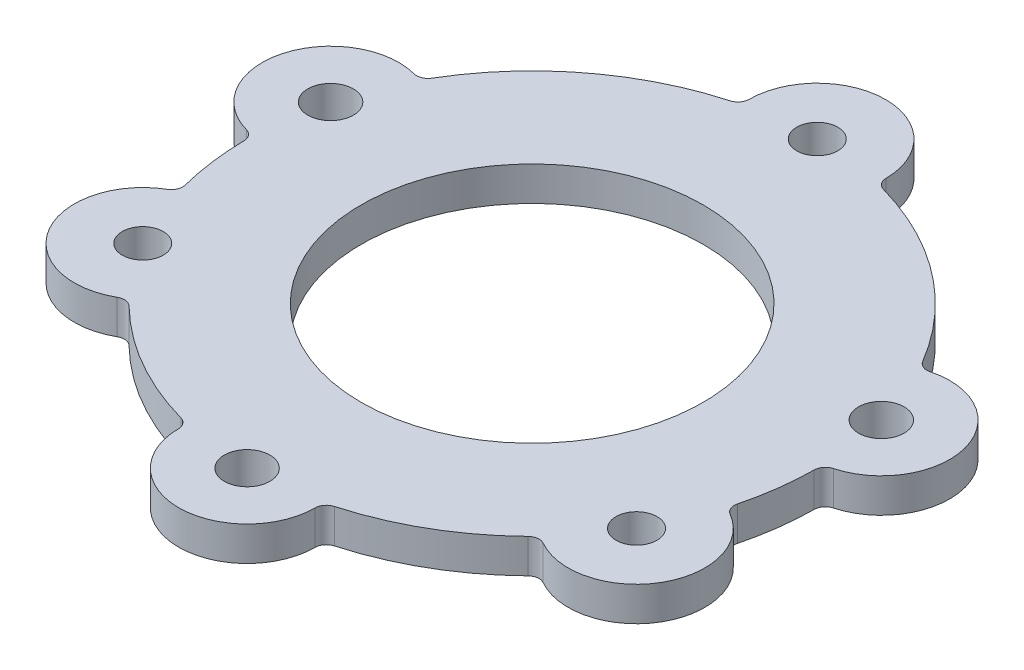
ISO-10303-21;
HEADER;
FILE_DESCRIPTION(('STEP AP214'),'2;1');
FILE_NAME('part.step','',(''),(''),'','','');
FILE_SCHEMA(('AUTOMOTIVE_DESIGN { 1 0 10303 214 1 1 1 1 }'));
ENDSEC;
DATA;
#1=APPLICATION_CONTEXT('core data for automotive mechanical design processes');
#2=APPLICATION_PROTOCOL_DEFINITION('international standard','automotive_design',2000,#1);
#3=PRODUCT_CONTEXT('',#1,'mechanical');
#4=PRODUCT('Part','Part','',(#3));
#5=PRODUCT_RELATED_PRODUCT_CATEGORY('part','',(#4));
#6=PRODUCT_DEFINITION_FORMATION('','',#4);
#7=PRODUCT_DEFINITION_CONTEXT('part definition',#1,'design');
#8=PRODUCT_DEFINITION('design','',#6,#7);
#9=PRODUCT_DEFINITION_SHAPE('','',#8);
#10=(LENGTH_UNIT() NAMED_UNIT(*) SI_UNIT(.MILLI.,.METRE.));
#11=(NAMED_UNIT(*) PLANE_ANGLE_UNIT() SI_UNIT($,.RADIAN.));
#12=(NAMED_UNIT(*) SI_UNIT($,.STERADIAN.) SOLID_ANGLE_UNIT());
#13=UNCERTAINTY_MEASURE_WITH_UNIT(LENGTH_MEASURE(1.E-05),#10,'distance_accuracy_value','');
#14=(GEOMETRIC_REPRESENTATION_CONTEXT(3) GLOBAL_UNCERTAINTY_ASSIGNED_CONTEXT((#13)) GLOBAL_UNIT_ASSIGNED_CONTEXT((#10,
#11,#12)) REPRESENTATION_CONTEXT('',''));
#15=CARTESIAN_POINT('',(0.,0.,0.));
#16=DIRECTION('',(0.,0.,1.));
#17=DIRECTION('',(1.,0.,0.));
#18=AXIS2_PLACEMENT_3D('',#15,#16,#17);
#19=CARTESIAN_POINT('',(0.,1.5,0.));
#20=DIRECTION('',(0.,-1.,0.));
#21=DIRECTION('',(0.,0.,-1.));
#22=AXIS2_PLACEMENT_3D('',#19,#20,#21);
#23=CYLINDRICAL_SURFACE('',#22,12.5);
#24=CARTESIAN_POINT('',(0.,0.,0.));
#25=DIRECTION('',(0.,1.,0.));
#26=DIRECTION('',(0.,0.,1.));
#27=AXIS2_PLACEMENT_3D('',#24,#25,#26);
#28=CIRCLE('',#27,12.5);
#29=CARTESIAN_POINT('',(3.36532966988113,0.,12.0384615384615));
#30=VERTEX_POINT('',#29);
#31=CARTESIAN_POINT('',(8.74294867984898,0.,8.93369175545737));
#32=VERTEX_POINT('',#31);
#33=EDGE_CURVE('E224',#30,#32,#28,.T.);
#34=ORIENTED_EDGE('',*,*,#33,.T.);
#35=DIRECTION('',(0.,-1.,0.));
#36=VECTOR('',#35,1.);
#37=CARTESIAN_POINT('',(8.74294867984898,1.5,8.93369175545737));
#38=LINE('',#37,#36);
#39=CARTESIAN_POINT('',(8.74294867984898,1.5,8.93369175545737));
#40=VERTEX_POINT('',#39);
#41=EDGE_CURVE('E241',#32,#40,#38,.F.);
#42=ORIENTED_EDGE('',*,*,#41,.T.);
#43=CARTESIAN_POINT('',(0.,1.5,0.));
#44=DIRECTION('',(0.,1.,0.));
#45=DIRECTION('',(0.,0.,1.));
#46=AXIS2_PLACEMENT_3D('',#43,#44,#45);
#47=CIRCLE('',#46,12.5);
#48=CARTESIAN_POINT('',(3.36532966988113,1.5,12.0384615384615));
#49=VERTEX_POINT('',#48);
#50=EDGE_CURVE('E344',#49,#40,#47,.T.);
#51=ORIENTED_EDGE('',*,*,#50,.F.);
#52=DIRECTION('',(0.,-1.,0.));
#53=VECTOR('',#52,1.);
#54=CARTESIAN_POINT('',(3.36532966988113,1.5,12.0384615384615));
#55=LINE('',#54,#53);
#56=EDGE_CURVE('E230',#49,#30,#55,.T.);
#57=ORIENTED_EDGE('',*,*,#56,.T.);
#58=EDGE_LOOP('',(#34,#42,#51,#57));
#59=FACE_BOUND('',#58,.T.);
#60=ADVANCED_FACE('F39',(#59),#23,.T.);
#61=CARTESIAN_POINT('',(10.8253175473055,1.5,6.25000000000006));
#62=DIRECTION('',(0.,-1.,0.));
#63=DIRECTION('',(0.,0.,-1.));
#64=AXIS2_PLACEMENT_3D('',#61,#62,#63);
#65=CYLINDRICAL_SURFACE('',#64,3.);
#66=CARTESIAN_POINT('',(10.8253175473055,1.5,6.25000000000006));
#67=DIRECTION('',(0.,1.,0.));
#68=DIRECTION('',(0.,0.,1.));
#69=AXIS2_PLACEMENT_3D('',#66,#67,#68);
#70=CIRCLE('',#69,3.);
#71=CARTESIAN_POINT('',(12.3401392070888,1.5,3.66053763513523));
#72=VERTEX_POINT('',#71);
#73=CARTESIAN_POINT('',(9.34018818708045,1.5,8.85660522200772));
#74=VERTEX_POINT('',#73);
#75=EDGE_CURVE('E349',#72,#74,#70,.F.);
#76=ORIENTED_EDGE('',*,*,#75,.T.);
#77=DIRECTION('',(0.,-1.,0.));
#78=VECTOR('',#77,1.);
#79=CARTESIAN_POINT('',(9.34018818708045,1.5,8.85660522200772));
#80=LINE('',#79,#78);
#81=CARTESIAN_POINT('',(9.34018818708045,0.,8.85660522200772));
#82=VERTEX_POINT('',#81);
#83=EDGE_CURVE('E223',#74,#82,#80,.T.);
#84=ORIENTED_EDGE('',*,*,#83,.T.);
#85=CARTESIAN_POINT('',(10.8253175473055,0.,6.25000000000006));
#86=DIRECTION('',(0.,1.,0.));
#87=DIRECTION('',(0.,0.,1.));
#88=AXIS2_PLACEMENT_3D('',#85,#86,#87);
#89=CIRCLE('',#88,3.);
#90=CARTESIAN_POINT('',(12.3401392070888,0.,3.66053763513523));
#91=VERTEX_POINT('',#90);
#92=EDGE_CURVE('E206',#91,#82,#89,.F.);
#93=ORIENTED_EDGE('',*,*,#92,.F.);
#94=DIRECTION('',(0.,-1.,0.));
#95=VECTOR('',#94,1.);
#96=CARTESIAN_POINT('',(12.3401392070888,1.5,3.66053763513523));
#97=LINE('',#96,#95);
#98=EDGE_CURVE('E220',#91,#72,#97,.F.);
#99=ORIENTED_EDGE('',*,*,#98,.T.);
#100=EDGE_LOOP('',(#76,#84,#93,#99));
#101=FACE_BOUND('',#100,.T.);
#102=ADVANCED_FACE('F219',(#101),#65,.T.);
#103=CARTESIAN_POINT('',(0.,1.5,0.));
#104=DIRECTION('',(0.,-1.,0.));
#105=DIRECTION('',(0.,0.,-1.));
#106=AXIS2_PLACEMENT_3D('',#103,#104,#105);
#107=CYLINDRICAL_SURFACE('',#106,12.5);
#108=CARTESIAN_POINT('',(0.,1.5,0.));
#109=DIRECTION('',(0.,1.,0.));
#110=DIRECTION('',(0.,0.,1.));
#111=AXIS2_PLACEMENT_3D('',#108,#109,#110);
#112=CIRCLE('',#111,12.5);
#113=CARTESIAN_POINT('',(12.1082783497301,1.5,3.10476978300426));
#114=VERTEX_POINT('',#113);
#115=CARTESIAN_POINT('',(12.4992723204014,1.5,0.134875722227054));
#116=VERTEX_POINT('',#115);
#117=EDGE_CURVE('E351',#114,#116,#112,.T.);
#118=ORIENTED_EDGE('',*,*,#117,.F.);
#119=DIRECTION('',(0.,-1.,0.));
#120=VECTOR('',#119,1.);
#121=CARTESIAN_POINT('',(12.1082783497301,1.5,3.10476978300426));
#122=LINE('',#121,#120);
#123=CARTESIAN_POINT('',(12.1082783497301,0.,3.10476978300426));
#124=VERTEX_POINT('',#123);
#125=EDGE_CURVE('E245',#114,#124,#122,.T.);
#126=ORIENTED_EDGE('',*,*,#125,.T.);
#127=CARTESIAN_POINT('',(0.,0.,0.));
#128=DIRECTION('',(0.,1.,0.));
#129=DIRECTION('',(0.,0.,1.));
#130=AXIS2_PLACEMENT_3D('',#127,#128,#129);
#131=CIRCLE('',#130,12.5);
#132=CARTESIAN_POINT('',(12.4992723204014,0.,0.134875722227054));
#133=VERTEX_POINT('',#132);
#134=EDGE_CURVE('E208',#124,#133,#131,.T.);
#135=ORIENTED_EDGE('',*,*,#134,.T.);
#136=DIRECTION('',(0.,-1.,0.));
#137=VECTOR('',#136,1.);
#138=CARTESIAN_POINT('',(12.4992723204014,1.5,0.134875722227054));
#139=LINE('',#138,#137);
#140=EDGE_CURVE('E243',#133,#116,#139,.F.);
#141=ORIENTED_EDGE('',*,*,#140,.T.);
#142=EDGE_LOOP('',(#118,#126,#135,#141));
#143=FACE_BOUND('',#142,.T.);
#144=ADVANCED_FACE('F464',(#143),#107,.T.);
#145=CARTESIAN_POINT('',(12.0740728286134,1.5,-3.23523806378147));
#146=DIRECTION('',(0.,-1.,0.));
#147=DIRECTION('',(0.,0.,-1.));
#148=AXIS2_PLACEMENT_3D('',#145,#146,#147);
#149=CYLINDRICAL_SURFACE('',#148,3.);
#150=CARTESIAN_POINT('',(12.0740728286134,1.5,-3.23523806378147));
#151=DIRECTION('',(0.,1.,0.));
#152=DIRECTION('',(0.,0.,1.));
#153=AXIS2_PLACEMENT_3D('',#150,#151,#152);
#154=CIRCLE('',#153,3.);
#155=CARTESIAN_POINT('',(11.3141870987112,1.5,-6.13740512952579));
#156=VERTEX_POINT('',#155);
#157=CARTESIAN_POINT('',(12.8670760154169,1.5,-0.341944793869236));
#158=VERTEX_POINT('',#157);
#159=EDGE_CURVE('E358',#156,#158,#154,.F.);
#160=ORIENTED_EDGE('',*,*,#159,.T.);
#161=DIRECTION('',(0.,-1.,0.));
#162=VECTOR('',#161,1.);
#163=CARTESIAN_POINT('',(12.8670760154169,1.5,-0.341944793869235));
#164=LINE('',#163,#162);
#165=CARTESIAN_POINT('',(12.8670760154169,0.,-0.341944793869236));
#166=VERTEX_POINT('',#165);
#167=EDGE_CURVE('E249',#158,#166,#164,.T.);
#168=ORIENTED_EDGE('',*,*,#167,.T.);
#169=CARTESIAN_POINT('',(12.0740728286134,0.,-3.23523806378147));
#170=DIRECTION('',(0.,1.,0.));
#171=DIRECTION('',(0.,0.,1.));
#172=AXIS2_PLACEMENT_3D('',#169,#170,#171);
#173=CIRCLE('',#172,3.);
#174=CARTESIAN_POINT('',(11.3141870987112,0.,-6.13740512952579));
#175=VERTEX_POINT('',#174);
#176=EDGE_CURVE('E401',#175,#166,#173,.F.);
#177=ORIENTED_EDGE('',*,*,#176,.F.);
#178=DIRECTION('',(0.,-1.,0.));
#179=VECTOR('',#178,1.);
#180=CARTESIAN_POINT('',(11.3141870987112,1.5,-6.13740512952579));
#181=LINE('',#180,#179);
#182=EDGE_CURVE('E247',#175,#156,#181,.F.);
#183=ORIENTED_EDGE('',*,*,#182,.T.);
#184=EDGE_LOOP('',(#160,#168,#177,#183));
#185=FACE_BOUND('',#184,.T.);
#186=ADVANCED_FACE('F560',(#185),#149,.T.);
#187=CARTESIAN_POINT('',(0.,1.5,0.));
#188=DIRECTION('',(0.,-1.,0.));
#189=DIRECTION('',(0.,0.,-1.));
#190=AXIS2_PLACEMENT_3D('',#187,#188,#189);
#191=CYLINDRICAL_SURFACE('',#190,12.5);
#192=CARTESIAN_POINT('',(0.,1.5,0.));
#193=DIRECTION('',(0.,1.,0.));
#194=DIRECTION('',(0.,0.,1.));
#195=AXIS2_PLACEMENT_3D('',#192,#193,#194);
#196=CIRCLE('',#195,12.5);
#197=CARTESIAN_POINT('',(10.7572494971738,1.5,-6.36644196200305));
#198=VERTEX_POINT('',#197);
#199=CARTESIAN_POINT('',(3.36532966988113,1.5,-12.0384615384615));
#200=VERTEX_POINT('',#199);
#201=EDGE_CURVE('E361',#198,#200,#196,.T.);
#202=ORIENTED_EDGE('',*,*,#201,.F.);
#203=DIRECTION('',(0.,-1.,0.));
#204=VECTOR('',#203,1.);
#205=CARTESIAN_POINT('',(10.7572494971738,1.5,-6.36644196200305));
#206=LINE('',#205,#204);
#207=CARTESIAN_POINT('',(10.7572494971738,0.,-6.36644196200305));
#208=VERTEX_POINT('',#207);
#209=EDGE_CURVE('E254',#198,#208,#206,.T.);
#210=ORIENTED_EDGE('',*,*,#209,.T.);
#211=CARTESIAN_POINT('',(0.,0.,0.));
#212=DIRECTION('',(0.,1.,0.));
#213=DIRECTION('',(0.,0.,1.));
#214=AXIS2_PLACEMENT_3D('',#211,#212,#213);
#215=CIRCLE('',#214,12.5);
#216=CARTESIAN_POINT('',(3.36532966988113,0.,-12.0384615384615));
#217=VERTEX_POINT('',#216);
#218=EDGE_CURVE('E404',#208,#217,#215,.T.);
#219=ORIENTED_EDGE('',*,*,#218,.T.);
#220=DIRECTION('',(0.,-1.,0.));
#221=VECTOR('',#220,1.);
#222=CARTESIAN_POINT('',(3.36532966988113,1.5,-12.0384615384615));
#223=LINE('',#222,#221);
#224=EDGE_CURVE('E252',#217,#200,#223,.F.);
#225=ORIENTED_EDGE('',*,*,#224,.T.);
#226=EDGE_LOOP('',(#202,#210,#219,#225));
#227=FACE_BOUND('',#226,.T.);
#228=ADVANCED_FACE('F554',(#227),#191,.T.);
#229=CARTESIAN_POINT('',(0.,1.5,-12.5));
#230=DIRECTION('',(0.,-1.,0.));
#231=DIRECTION('',(0.,0.,-1.));
#232=AXIS2_PLACEMENT_3D('',#229,#230,#231);
#233=CYLINDRICAL_SURFACE('',#232,3.);
#234=CARTESIAN_POINT('',(0.,1.5,-12.5));
#235=DIRECTION('',(0.,1.,0.));
#236=DIRECTION('',(0.,0.,1.));
#237=AXIS2_PLACEMENT_3D('',#234,#235,#236);
#238=CIRCLE('',#237,3.);
#239=CARTESIAN_POINT('',(-2.99995102000833,1.5,-12.5171428571429));
#240=VERTEX_POINT('',#239);
#241=CARTESIAN_POINT('',(2.99995102000832,1.5,-12.5171428571429));
#242=VERTEX_POINT('',#241);
#243=EDGE_CURVE('E364',#240,#242,#238,.F.);
#244=ORIENTED_EDGE('',*,*,#243,.T.);
#245=DIRECTION('',(0.,-1.,0.));
#246=VECTOR('',#245,1.);
#247=CARTESIAN_POINT('',(2.99995102000832,1.5,-12.5171428571429));
#248=LINE('',#247,#246);
#249=CARTESIAN_POINT('',(2.99995102000832,0.,-12.5171428571429));
#250=VERTEX_POINT('',#249);
#251=EDGE_CURVE('E259',#242,#250,#248,.T.);
#252=ORIENTED_EDGE('',*,*,#251,.T.);
#253=CARTESIAN_POINT('',(0.,0.,-12.5));
#254=DIRECTION('',(0.,1.,0.));
#255=DIRECTION('',(0.,0.,1.));
#256=AXIS2_PLACEMENT_3D('',#253,#254,#255);
#257=CIRCLE('',#256,3.);
#258=CARTESIAN_POINT('',(-2.99995102000833,0.,-12.5171428571429));
#259=VERTEX_POINT('',#258);
#260=EDGE_CURVE('E407',#259,#250,#257,.F.);
#261=ORIENTED_EDGE('',*,*,#260,.F.);
#262=DIRECTION('',(0.,-1.,0.));
#263=VECTOR('',#262,1.);
#264=CARTESIAN_POINT('',(-2.99995102000833,1.5,-12.5171428571429));
#265=LINE('',#264,#263);
#266=EDGE_CURVE('E257',#259,#240,#265,.F.);
#267=ORIENTED_EDGE('',*,*,#266,.T.);
#268=EDGE_LOOP('',(#244,#252,#261,#267));
#269=FACE_BOUND('',#268,.T.);
#270=ADVANCED_FACE('F546',(#269),#233,.T.);
#271=CARTESIAN_POINT('',(0.,1.5,0.));
#272=DIRECTION('',(0.,-1.,0.));
#273=DIRECTION('',(0.,0.,-1.));
#274=AXIS2_PLACEMENT_3D('',#271,#272,#273);
#275=CYLINDRICAL_SURFACE('',#274,12.5);
#276=CARTESIAN_POINT('',(0.,1.5,0.));
#277=DIRECTION('',(0.,1.,0.));
#278=DIRECTION('',(0.,0.,1.));
#279=AXIS2_PLACEMENT_3D('',#276,#277,#278);
#280=CIRCLE('',#279,12.5);
#281=CARTESIAN_POINT('',(-3.36532966988114,1.5,-12.0384615384615));
#282=VERTEX_POINT('',#281);
#283=CARTESIAN_POINT('',(-10.7572494971738,1.5,-6.36644196200305));
#284=VERTEX_POINT('',#283);
#285=EDGE_CURVE('E367',#282,#284,#280,.T.);
#286=ORIENTED_EDGE('',*,*,#285,.F.);
#287=DIRECTION('',(0.,-1.,0.));
#288=VECTOR('',#287,1.);
#289=CARTESIAN_POINT('',(-3.36532966988114,1.5,-12.0384615384615));
#290=LINE('',#289,#288);
#291=CARTESIAN_POINT('',(-3.36532966988114,0.,-12.0384615384615));
#292=VERTEX_POINT('',#291);
#293=EDGE_CURVE('E264',#282,#292,#290,.T.);
#294=ORIENTED_EDGE('',*,*,#293,.T.);
#295=CARTESIAN_POINT('',(0.,0.,0.));
#296=DIRECTION('',(0.,1.,0.));
#297=DIRECTION('',(0.,0.,1.));
#298=AXIS2_PLACEMENT_3D('',#295,#296,#297);
#299=CIRCLE('',#298,12.5);
#300=CARTESIAN_POINT('',(-10.7572494971738,0.,-6.36644196200305));
#301=VERTEX_POINT('',#300);
#302=EDGE_CURVE('E410',#292,#301,#299,.T.);
#303=ORIENTED_EDGE('',*,*,#302,.T.);
#304=DIRECTION('',(0.,-1.,0.));
#305=VECTOR('',#304,1.);
#306=CARTESIAN_POINT('',(-10.7572494971738,1.5,-6.36644196200305));
#307=LINE('',#306,#305);
#308=EDGE_CURVE('E262',#301,#284,#307,.F.);
#309=ORIENTED_EDGE('',*,*,#308,.T.);
#310=EDGE_LOOP('',(#286,#294,#303,#309));
#311=FACE_BOUND('',#310,.T.);
#312=ADVANCED_FACE('F540',(#311),#275,.T.);
#313=CARTESIAN_POINT('',(-12.0740728286134,1.5,-3.23523806378147));
#314=DIRECTION('',(0.,-1.,0.));
#315=DIRECTION('',(0.,0.,-1.));
#316=AXIS2_PLACEMENT_3D('',#313,#314,#315);
#317=CYLINDRICAL_SURFACE('',#316,3.);
#318=CARTESIAN_POINT('',(-12.0740728286134,1.5,-3.23523806378147));
#319=DIRECTION('',(0.,1.,0.));
#320=DIRECTION('',(0.,0.,1.));
#321=AXIS2_PLACEMENT_3D('',#318,#319,#320);
#322=CIRCLE('',#321,3.);
#323=CARTESIAN_POINT('',(-11.3141870987112,1.5,-6.13740512952579));
#324=VERTEX_POINT('',#323);
#325=CARTESIAN_POINT('',(-12.8670760154169,1.5,-0.341944793869236));
#326=VERTEX_POINT('',#325);
#327=EDGE_CURVE('E370',#324,#326,#322,.T.);
#328=ORIENTED_EDGE('',*,*,#327,.F.);
#329=DIRECTION('',(0.,-1.,0.));
#330=VECTOR('',#329,1.);
#331=CARTESIAN_POINT('',(-11.3141870987112,1.5,-6.13740512952579));
#332=LINE('',#331,#330);
#333=CARTESIAN_POINT('',(-11.3141870987112,0.,-6.13740512952579));
#334=VERTEX_POINT('',#333);
#335=EDGE_CURVE('E269',#324,#334,#332,.T.);
#336=ORIENTED_EDGE('',*,*,#335,.T.);
#337=CARTESIAN_POINT('',(-12.0740728286134,0.,-3.23523806378147));
#338=DIRECTION('',(0.,1.,0.));
#339=DIRECTION('',(0.,0.,1.));
#340=AXIS2_PLACEMENT_3D('',#337,#338,#339);
#341=CIRCLE('',#340,3.);
#342=CARTESIAN_POINT('',(-12.8670760154169,0.,-0.341944793869236));
#343=VERTEX_POINT('',#342);
#344=EDGE_CURVE('E413',#334,#343,#341,.T.);
#345=ORIENTED_EDGE('',*,*,#344,.T.);
#346=DIRECTION('',(0.,-1.,0.));
#347=VECTOR('',#346,1.);
#348=CARTESIAN_POINT('',(-12.8670760154169,1.5,-0.341944793869236));
#349=LINE('',#348,#347);
#350=EDGE_CURVE('E267',#343,#326,#349,.F.);
#351=ORIENTED_EDGE('',*,*,#350,.T.);
#352=EDGE_LOOP('',(#328,#336,#345,#351));
#353=FACE_BOUND('',#352,.T.);
#354=ADVANCED_FACE('F533',(#353),#317,.T.);
#355=CARTESIAN_POINT('',(0.,1.5,0.));
#356=DIRECTION('',(0.,-1.,0.));
#357=DIRECTION('',(0.,0.,-1.));
#358=AXIS2_PLACEMENT_3D('',#355,#356,#357);
#359=CYLINDRICAL_SURFACE('',#358,12.5);
#360=CARTESIAN_POINT('',(0.,1.5,0.));
#361=DIRECTION('',(0.,1.,0.));
#362=DIRECTION('',(0.,0.,1.));
#363=AXIS2_PLACEMENT_3D('',#360,#361,#362);
#364=CIRCLE('',#363,12.5);
#365=CARTESIAN_POINT('',(-12.4992723204014,1.5,0.134875722227054));
#366=VERTEX_POINT('',#365);
#367=CARTESIAN_POINT('',(-12.1082783497302,1.5,3.1047697830041));
#368=VERTEX_POINT('',#367);
#369=EDGE_CURVE('E373',#366,#368,#364,.T.);
#370=ORIENTED_EDGE('',*,*,#369,.F.);
#371=DIRECTION('',(0.,-1.,0.));
#372=VECTOR('',#371,1.);
#373=CARTESIAN_POINT('',(-12.4992723204014,1.5,0.134875722227054));
#374=LINE('',#373,#372);
#375=CARTESIAN_POINT('',(-12.4992723204014,0.,0.134875722227054));
#376=VERTEX_POINT('',#375);
#377=EDGE_CURVE('E274',#366,#376,#374,.T.);
#378=ORIENTED_EDGE('',*,*,#377,.T.);
#379=CARTESIAN_POINT('',(0.,0.,0.));
#380=DIRECTION('',(0.,1.,0.));
#381=DIRECTION('',(0.,0.,1.));
#382=AXIS2_PLACEMENT_3D('',#379,#380,#381);
#383=CIRCLE('',#382,12.5);
#384=CARTESIAN_POINT('',(-12.1082783497302,0.,3.1047697830041));
#385=VERTEX_POINT('',#384);
#386=EDGE_CURVE('E416',#376,#385,#383,.T.);
#387=ORIENTED_EDGE('',*,*,#386,.T.);
#388=DIRECTION('',(0.,-1.,0.));
#389=VECTOR('',#388,1.);
#390=CARTESIAN_POINT('',(-12.1082783497302,1.5,3.1047697830041));
#391=LINE('',#390,#389);
#392=EDGE_CURVE('E272',#385,#368,#391,.F.);
#393=ORIENTED_EDGE('',*,*,#392,.T.);
#394=EDGE_LOOP('',(#370,#378,#387,#393));
#395=FACE_BOUND('',#394,.T.);
#396=ADVANCED_FACE('F526',(#395),#359,.T.);
#397=CARTESIAN_POINT('',(-10.8253175473056,1.5,6.24999999999991));
#398=DIRECTION('',(0.,-1.,0.));
#399=DIRECTION('',(0.,0.,-1.));
#400=AXIS2_PLACEMENT_3D('',#397,#398,#399);
#401=CYLINDRICAL_SURFACE('',#400,3.);
#402=CARTESIAN_POINT('',(-10.8253175473056,1.5,6.24999999999991));
#403=DIRECTION('',(0.,1.,0.));
#404=DIRECTION('',(0.,0.,1.));
#405=AXIS2_PLACEMENT_3D('',#402,#403,#404);
#406=CIRCLE('',#405,3.);
#407=CARTESIAN_POINT('',(-9.34018818708057,1.5,8.8566052220076));
#408=VERTEX_POINT('',#407);
#409=CARTESIAN_POINT('',(-12.3401392070888,1.5,3.66053763513507));
#410=VERTEX_POINT('',#409);
#411=EDGE_CURVE('E376',#408,#410,#406,.F.);
#412=ORIENTED_EDGE('',*,*,#411,.T.);
#413=DIRECTION('',(0.,-1.,0.));
#414=VECTOR('',#413,1.);
#415=CARTESIAN_POINT('',(-12.3401392070888,1.5,3.66053763513507));
#416=LINE('',#415,#414);
#417=CARTESIAN_POINT('',(-12.3401392070888,0.,3.66053763513507));
#418=VERTEX_POINT('',#417);
#419=EDGE_CURVE('E279',#410,#418,#416,.T.);
#420=ORIENTED_EDGE('',*,*,#419,.T.);
#421=CARTESIAN_POINT('',(-10.8253175473056,0.,6.24999999999991));
#422=DIRECTION('',(0.,1.,0.));
#423=DIRECTION('',(0.,0.,1.));
#424=AXIS2_PLACEMENT_3D('',#421,#422,#423);
#425=CIRCLE('',#424,3.);
#426=CARTESIAN_POINT('',(-9.34018818708057,0.,8.8566052220076));
#427=VERTEX_POINT('',#426);
#428=EDGE_CURVE('E419',#427,#418,#425,.F.);
#429=ORIENTED_EDGE('',*,*,#428,.F.);
#430=DIRECTION('',(0.,-1.,0.));
#431=VECTOR('',#430,1.);
#432=CARTESIAN_POINT('',(-9.34018818708057,1.5,8.8566052220076));
#433=LINE('',#432,#431);
#434=EDGE_CURVE('E277',#427,#408,#433,.F.);
#435=ORIENTED_EDGE('',*,*,#434,.T.);
#436=EDGE_LOOP('',(#412,#420,#429,#435));
#437=FACE_BOUND('',#436,.T.);
#438=ADVANCED_FACE('F455',(#437),#401,.T.);
#439=CARTESIAN_POINT('',(0.,1.5,0.));
#440=DIRECTION('',(0.,-1.,0.));
#441=DIRECTION('',(0.,0.,-1.));
#442=AXIS2_PLACEMENT_3D('',#439,#440,#441);
#443=CYLINDRICAL_SURFACE('',#442,12.5);
#444=CARTESIAN_POINT('',(0.,1.5,0.));
#445=DIRECTION('',(0.,1.,0.));
#446=DIRECTION('',(0.,0.,1.));
#447=AXIS2_PLACEMENT_3D('',#444,#445,#446);
#448=CIRCLE('',#447,12.5);
#449=CARTESIAN_POINT('',(-8.7429486798491,1.5,8.93369175545725));
#450=VERTEX_POINT('',#449);
#451=CARTESIAN_POINT('',(-3.36532966988114,1.5,12.0384615384615));
#452=VERTEX_POINT('',#451);
#453=EDGE_CURVE('E379',#450,#452,#448,.T.);
#454=ORIENTED_EDGE('',*,*,#453,.F.);
#455=DIRECTION('',(0.,-1.,0.));
#456=VECTOR('',#455,1.);
#457=CARTESIAN_POINT('',(-8.7429486798491,1.5,8.93369175545725));
#458=LINE('',#457,#456);
#459=CARTESIAN_POINT('',(-8.7429486798491,0.,8.93369175545725));
#460=VERTEX_POINT('',#459);
#461=EDGE_CURVE('E284',#450,#460,#458,.T.);
#462=ORIENTED_EDGE('',*,*,#461,.T.);
#463=CARTESIAN_POINT('',(0.,0.,0.));
#464=DIRECTION('',(0.,1.,0.));
#465=DIRECTION('',(0.,0.,1.));
#466=AXIS2_PLACEMENT_3D('',#463,#464,#465);
#467=CIRCLE('',#466,12.5);
#468=CARTESIAN_POINT('',(-3.36532966988114,0.,12.0384615384615));
#469=VERTEX_POINT('',#468);
#470=EDGE_CURVE('E337',#460,#469,#467,.T.);
#471=ORIENTED_EDGE('',*,*,#470,.T.);
#472=DIRECTION('',(0.,-1.,0.));
#473=VECTOR('',#472,1.);
#474=CARTESIAN_POINT('',(-3.36532966988114,1.5,12.0384615384615));
#475=LINE('',#474,#473);
#476=EDGE_CURVE('E282',#469,#452,#475,.F.);
#477=ORIENTED_EDGE('',*,*,#476,.T.);
#478=EDGE_LOOP('',(#454,#462,#471,#477));
#479=FACE_BOUND('',#478,.T.);
#480=ADVANCED_FACE('F445',(#479),#443,.T.);
#481=CARTESIAN_POINT('',(0.,1.5,-12.5));
#482=DIRECTION('',(0.,-1.,0.));
#483=DIRECTION('',(0.,0.,-1.));
#484=AXIS2_PLACEMENT_3D('',#481,#482,#483);
#485=CYLINDRICAL_SURFACE('',#484,0.9);
#486=CARTESIAN_POINT('',(0.,1.5,-12.5));
#487=DIRECTION('',(0.,1.,0.));
#488=DIRECTION('',(0.,0.,1.));
#489=AXIS2_PLACEMENT_3D('',#486,#487,#488);
#490=CIRCLE('',#489,0.9);
#491=CARTESIAN_POINT('',(0.,1.5,-11.6));
#492=VERTEX_POINT('',#491);
#493=EDGE_CURVE('E233',#492,#492,#490,.T.);
#494=ORIENTED_EDGE('',*,*,#493,.T.);
#495=EDGE_LOOP('',(#494));
#496=FACE_BOUND('',#495,.T.);
#497=CARTESIAN_POINT('',(0.,0.,-12.5));
#498=DIRECTION('',(0.,1.,0.));
#499=DIRECTION('',(0.,0.,1.));
#500=AXIS2_PLACEMENT_3D('',#497,#498,#499);
#501=CIRCLE('',#500,0.9);
#502=CARTESIAN_POINT('',(0.,0.,-11.6));
#503=VERTEX_POINT('',#502);
#504=EDGE_CURVE('E354',#503,#503,#501,.T.);
#505=ORIENTED_EDGE('',*,*,#504,.F.);
#506=EDGE_LOOP('',(#505));
#507=FACE_BOUND('',#506,.T.);
#508=ADVANCED_FACE('F442',(#496,#507),#485,.F.);
#509=CARTESIAN_POINT('',(12.0740728286134,1.5,-3.23523806378147));
#510=DIRECTION('',(0.,-1.,0.));
#511=DIRECTION('',(0.,0.,-1.));
#512=AXIS2_PLACEMENT_3D('',#509,#510,#511);
#513=CYLINDRICAL_SURFACE('',#512,1.);
#514=CARTESIAN_POINT('',(12.0740728286134,1.5,-3.23523806378147));
#515=DIRECTION('',(0.,1.,0.));
#516=DIRECTION('',(0.,0.,1.));
#517=AXIS2_PLACEMENT_3D('',#514,#515,#516);
#518=CIRCLE('',#517,1.);
#519=CARTESIAN_POINT('',(12.0740728286134,1.5,-2.23523806378147));
#520=VERTEX_POINT('',#519);
#521=EDGE_CURVE('E394',#520,#520,#518,.F.);
#522=ORIENTED_EDGE('',*,*,#521,.F.);
#523=EDGE_LOOP('',(#522));
#524=FACE_BOUND('',#523,.T.);
#525=CARTESIAN_POINT('',(12.0740728286134,0.,-3.23523806378147));
#526=DIRECTION('',(0.,1.,0.));
#527=DIRECTION('',(0.,0.,1.));
#528=AXIS2_PLACEMENT_3D('',#525,#526,#527);
#529=CIRCLE('',#528,1.);
#530=CARTESIAN_POINT('',(12.0740728286134,0.,-2.23523806378147));
#531=VERTEX_POINT('',#530);
#532=EDGE_CURVE('E435',#531,#531,#529,.F.);
#533=ORIENTED_EDGE('',*,*,#532,.T.);
#534=EDGE_LOOP('',(#533));
#535=FACE_BOUND('',#534,.T.);
#536=ADVANCED_FACE('F444',(#524,#535),#513,.F.);
#537=CARTESIAN_POINT('',(10.8253175473055,1.5,6.25000000000006));
#538=DIRECTION('',(0.,-1.,0.));
#539=DIRECTION('',(0.,0.,-1.));
#540=AXIS2_PLACEMENT_3D('',#537,#538,#539);
#541=CYLINDRICAL_SURFACE('',#540,0.9);
#542=CARTESIAN_POINT('',(10.8253175473055,1.5,6.25000000000006));
#543=DIRECTION('',(0.,1.,0.));
#544=DIRECTION('',(0.,0.,1.));
#545=AXIS2_PLACEMENT_3D('',#542,#543,#544);
#546=CIRCLE('',#545,0.9);
#547=CARTESIAN_POINT('',(10.8253175473055,1.5,7.15000000000006));
#548=VERTEX_POINT('',#547);
#549=EDGE_CURVE('E391',#548,#548,#546,.T.);
#550=ORIENTED_EDGE('',*,*,#549,.T.);
#551=EDGE_LOOP('',(#550));
#552=FACE_BOUND('',#551,.T.);
#553=CARTESIAN_POINT('',(10.8253175473055,0.,6.25000000000006));
#554=DIRECTION('',(0.,1.,0.));
#555=DIRECTION('',(0.,0.,1.));
#556=AXIS2_PLACEMENT_3D('',#553,#554,#555);
#557=CIRCLE('',#556,0.9);
#558=CARTESIAN_POINT('',(10.8253175473055,0.,7.15000000000006));
#559=VERTEX_POINT('',#558);
#560=EDGE_CURVE('E432',#559,#559,#557,.T.);
#561=ORIENTED_EDGE('',*,*,#560,.F.);
#562=EDGE_LOOP('',(#561));
#563=FACE_BOUND('',#562,.T.);
#564=ADVANCED_FACE('F452',(#552,#563),#541,.F.);
#565=CARTESIAN_POINT('',(-10.8253175473056,1.5,6.24999999999991));
#566=DIRECTION('',(0.,-1.,0.));
#567=DIRECTION('',(0.,0.,-1.));
#568=AXIS2_PLACEMENT_3D('',#565,#566,#567);
#569=CYLINDRICAL_SURFACE('',#568,0.9);
#570=CARTESIAN_POINT('',(-10.8253175473056,1.5,6.24999999999991));
#571=DIRECTION('',(0.,1.,0.));
#572=DIRECTION('',(0.,0.,1.));
#573=AXIS2_PLACEMENT_3D('',#570,#571,#572);
#574=CIRCLE('',#573,0.9);
#575=CARTESIAN_POINT('',(-10.8253175473056,1.5,7.14999999999991));
#576=VERTEX_POINT('',#575);
#577=EDGE_CURVE('E388',#576,#576,#574,.T.);
#578=ORIENTED_EDGE('',*,*,#577,.T.);
#579=EDGE_LOOP('',(#578));
#580=FACE_BOUND('',#579,.T.);
#581=CARTESIAN_POINT('',(-10.8253175473056,0.,6.24999999999991));
#582=DIRECTION('',(0.,1.,0.));
#583=DIRECTION('',(0.,0.,1.));
#584=AXIS2_PLACEMENT_3D('',#581,#582,#583);
#585=CIRCLE('',#584,0.9);
#586=CARTESIAN_POINT('',(-10.8253175473056,0.,7.14999999999991));
#587=VERTEX_POINT('',#586);
#588=EDGE_CURVE('E429',#587,#587,#585,.T.);
#589=ORIENTED_EDGE('',*,*,#588,.F.);
#590=EDGE_LOOP('',(#589));
#591=FACE_BOUND('',#590,.T.);
#592=ADVANCED_FACE('F595',(#580,#591),#569,.F.);
#593=CARTESIAN_POINT('',(0.,1.5,0.));
#594=DIRECTION('',(0.,-1.,0.));
#595=DIRECTION('',(0.,0.,-1.));
#596=AXIS2_PLACEMENT_3D('',#593,#594,#595);
#597=CYLINDRICAL_SURFACE('',#596,7.5);
#598=CARTESIAN_POINT('',(0.,1.5,0.));
#599=DIRECTION('',(0.,1.,0.));
#600=DIRECTION('',(0.,0.,1.));
#601=AXIS2_PLACEMENT_3D('',#598,#599,#600);
#602=CIRCLE('',#601,7.5);
#603=CARTESIAN_POINT('',(0.,1.5,7.5));
#604=VERTEX_POINT('',#603);
#605=EDGE_CURVE('E385',#604,#604,#602,.T.);
#606=ORIENTED_EDGE('',*,*,#605,.T.);
#607=EDGE_LOOP('',(#606));
#608=FACE_BOUND('',#607,.T.);
#609=CARTESIAN_POINT('',(0.,0.,0.));
#610=DIRECTION('',(0.,1.,0.));
#611=DIRECTION('',(0.,0.,1.));
#612=AXIS2_PLACEMENT_3D('',#609,#610,#611);
#613=CIRCLE('',#612,7.5);
#614=CARTESIAN_POINT('',(0.,0.,7.5));
#615=VERTEX_POINT('',#614);
#616=EDGE_CURVE('E426',#615,#615,#613,.T.);
#617=ORIENTED_EDGE('',*,*,#616,.F.);
#618=EDGE_LOOP('',(#617));
#619=FACE_BOUND('',#618,.T.);
#620=ADVANCED_FACE('F591',(#608,#619),#597,.F.);
#621=CARTESIAN_POINT('',(0.,1.5,12.5));
#622=DIRECTION('',(0.,-1.,0.));
#623=DIRECTION('',(0.,0.,-1.));
#624=AXIS2_PLACEMENT_3D('',#621,#622,#623);
#625=CYLINDRICAL_SURFACE('',#624,1.);
#626=CARTESIAN_POINT('',(0.,1.5,12.5));
#627=DIRECTION('',(0.,1.,0.));
#628=DIRECTION('',(0.,0.,1.));
#629=AXIS2_PLACEMENT_3D('',#626,#627,#628);
#630=CIRCLE('',#629,1.);
#631=CARTESIAN_POINT('',(0.,1.5,13.5));
#632=VERTEX_POINT('',#631);
#633=EDGE_CURVE('E382',#632,#632,#630,.T.);
#634=ORIENTED_EDGE('',*,*,#633,.T.);
#635=EDGE_LOOP('',(#634));
#636=FACE_BOUND('',#635,.T.);
#637=CARTESIAN_POINT('',(0.,0.,12.5));
#638=DIRECTION('',(0.,1.,0.));
#639=DIRECTION('',(0.,0.,1.));
#640=AXIS2_PLACEMENT_3D('',#637,#638,#639);
#641=CIRCLE('',#640,1.);
#642=CARTESIAN_POINT('',(0.,0.,13.5));
#643=VERTEX_POINT('',#642);
#644=EDGE_CURVE('E336',#643,#643,#641,.T.);
#645=ORIENTED_EDGE('',*,*,#644,.F.);
#646=EDGE_LOOP('',(#645));
#647=FACE_BOUND('',#646,.T.);
#648=ADVANCED_FACE('F588',(#636,#647),#625,.F.);
#649=CARTESIAN_POINT('',(0.,1.5,12.5));
#650=DIRECTION('',(0.,-1.,0.));
#651=DIRECTION('',(0.,0.,-1.));
#652=AXIS2_PLACEMENT_3D('',#649,#650,#651);
#653=CYLINDRICAL_SURFACE('',#652,3.);
#654=CARTESIAN_POINT('',(0.,1.5,12.5));
#655=DIRECTION('',(0.,1.,0.));
#656=DIRECTION('',(0.,0.,1.));
#657=AXIS2_PLACEMENT_3D('',#654,#655,#656);
#658=CIRCLE('',#657,3.);
#659=CARTESIAN_POINT('',(-2.99995102000833,1.5,12.5171428571429));
#660=VERTEX_POINT('',#659);
#661=CARTESIAN_POINT('',(2.99995102000832,1.5,12.5171428571429));
#662=VERTEX_POINT('',#661);
#663=EDGE_CURVE('E346',#660,#662,#658,.T.);
#664=ORIENTED_EDGE('',*,*,#663,.F.);
#665=DIRECTION('',(0.,-1.,0.));
#666=VECTOR('',#665,1.);
#667=CARTESIAN_POINT('',(-2.99995102000833,1.5,12.5171428571429));
#668=LINE('',#667,#666);
#669=CARTESIAN_POINT('',(-2.99995102000833,0.,12.5171428571429));
#670=VERTEX_POINT('',#669);
#671=EDGE_CURVE('E288',#660,#670,#668,.T.);
#672=ORIENTED_EDGE('',*,*,#671,.T.);
#673=CARTESIAN_POINT('',(0.,0.,12.5));
#674=DIRECTION('',(0.,1.,0.));
#675=DIRECTION('',(0.,0.,1.));
#676=AXIS2_PLACEMENT_3D('',#673,#674,#675);
#677=CIRCLE('',#676,3.);
#678=CARTESIAN_POINT('',(2.99995102000832,0.,12.5171428571429));
#679=VERTEX_POINT('',#678);
#680=EDGE_CURVE('E330',#670,#679,#677,.T.);
#681=ORIENTED_EDGE('',*,*,#680,.T.);
#682=DIRECTION('',(0.,-1.,0.));
#683=VECTOR('',#682,1.);
#684=CARTESIAN_POINT('',(2.99995102000832,1.5,12.5171428571429));
#685=LINE('',#684,#683);
#686=EDGE_CURVE('E54',#679,#662,#685,.F.);
#687=ORIENTED_EDGE('',*,*,#686,.T.);
#688=EDGE_LOOP('',(#664,#672,#681,#687));
#689=FACE_BOUND('',#688,.T.);
#690=ADVANCED_FACE('F334',(#689),#653,.T.);
#691=CARTESIAN_POINT('',(-12.0740728286134,1.5,-3.23523806378147));
#692=DIRECTION('',(0.,-1.,0.));
#693=DIRECTION('',(0.,0.,-1.));
#694=AXIS2_PLACEMENT_3D('',#691,#692,#693);
#695=CYLINDRICAL_SURFACE('',#694,1.);
#696=CARTESIAN_POINT('',(-12.0740728286134,1.5,-3.23523806378147));
#697=DIRECTION('',(0.,1.,0.));
#698=DIRECTION('',(0.,0.,1.));
#699=AXIS2_PLACEMENT_3D('',#696,#697,#698);
#700=CIRCLE('',#699,1.);
#701=CARTESIAN_POINT('',(-12.0740728286134,1.5,-2.23523806378147));
#702=VERTEX_POINT('',#701);
#703=EDGE_CURVE('E228',#702,#702,#700,.T.);
#704=ORIENTED_EDGE('',*,*,#703,.T.);
#705=EDGE_LOOP('',(#704));
#706=FACE_BOUND('',#705,.T.);
#707=CARTESIAN_POINT('',(-12.0740728286134,0.,-3.23523806378147));
#708=DIRECTION('',(0.,1.,0.));
#709=DIRECTION('',(0.,0.,1.));
#710=AXIS2_PLACEMENT_3D('',#707,#708,#709);
#711=CIRCLE('',#710,1.);
#712=CARTESIAN_POINT('',(-12.0740728286134,0.,-2.23523806378147));
#713=VERTEX_POINT('',#712);
#714=EDGE_CURVE('E236',#713,#713,#711,.T.);
#715=ORIENTED_EDGE('',*,*,#714,.F.);
#716=EDGE_LOOP('',(#715));
#717=FACE_BOUND('',#716,.T.);
#718=ADVANCED_FACE('F587',(#706,#717),#695,.F.);
#719=CARTESIAN_POINT('',(0.,1.5,0.));
#720=DIRECTION('',(0.,1.,0.));
#721=DIRECTION('',(0.,0.,1.));
#722=AXIS2_PLACEMENT_3D('',#719,#720,#721);
#723=PLANE('',#722);
#724=ORIENTED_EDGE('',*,*,#663,.T.);
#725=CARTESIAN_POINT('',(3.49994285667638,1.5,12.52));
#726=DIRECTION('',(0.,1.,0.));
#727=DIRECTION('',(0.,0.,1.));
#728=AXIS2_PLACEMENT_3D('',#725,#726,#727);
#729=CIRCLE('',#728,0.5);
#730=EDGE_CURVE('E11',#662,#49,#729,.F.);
#731=ORIENTED_EDGE('',*,*,#730,.T.);
#732=ORIENTED_EDGE('',*,*,#50,.T.);
#733=CARTESIAN_POINT('',(9.09266662704294,1.5,9.29103942567566));
#734=DIRECTION('',(0.,1.,0.));
#735=DIRECTION('',(0.,0.,1.));
#736=AXIS2_PLACEMENT_3D('',#733,#734,#735);
#737=CIRCLE('',#736,0.5);
#738=EDGE_CURVE('E214',#40,#74,#737,.F.);
#739=ORIENTED_EDGE('',*,*,#738,.T.);
#740=ORIENTED_EDGE('',*,*,#75,.F.);
#741=CARTESIAN_POINT('',(12.5926094837193,1.5,3.22896057432443));
#742=DIRECTION('',(0.,1.,0.));
#743=DIRECTION('',(0.,0.,1.));
#744=AXIS2_PLACEMENT_3D('',#741,#742,#743);
#745=CIRCLE('',#744,0.5);
#746=EDGE_CURVE('E213',#72,#114,#745,.F.);
#747=ORIENTED_EDGE('',*,*,#746,.T.);
#748=ORIENTED_EDGE('',*,*,#117,.T.);
#749=CARTESIAN_POINT('',(12.9992432132175,1.5,0.140270751116136));
#750=DIRECTION('',(0.,1.,0.));
#751=DIRECTION('',(0.,0.,1.));
#752=AXIS2_PLACEMENT_3D('',#749,#750,#751);
#753=CIRCLE('',#752,0.5);
#754=EDGE_CURVE('E297',#116,#158,#753,.F.);
#755=ORIENTED_EDGE('',*,*,#754,.T.);
#756=ORIENTED_EDGE('',*,*,#159,.F.);
#757=CARTESIAN_POINT('',(11.1875394770608,1.5,-6.62109964048317));
#758=DIRECTION('',(0.,1.,0.));
#759=DIRECTION('',(0.,0.,1.));
#760=AXIS2_PLACEMENT_3D('',#757,#758,#759);
#761=CIRCLE('',#760,0.5);
#762=EDGE_CURVE('E301',#156,#198,#761,.F.);
#763=ORIENTED_EDGE('',*,*,#762,.T.);
#764=ORIENTED_EDGE('',*,*,#201,.T.);
#765=CARTESIAN_POINT('',(3.49994285667637,1.5,-12.52));
#766=DIRECTION('',(0.,1.,0.));
#767=DIRECTION('',(0.,0.,1.));
#768=AXIS2_PLACEMENT_3D('',#765,#766,#767);
#769=CIRCLE('',#768,0.5);
#770=EDGE_CURVE('E305',#200,#242,#769,.F.);
#771=ORIENTED_EDGE('',*,*,#770,.T.);
#772=ORIENTED_EDGE('',*,*,#243,.F.);
#773=CARTESIAN_POINT('',(-3.49994285667639,1.5,-12.52));
#774=DIRECTION('',(0.,1.,0.));
#775=DIRECTION('',(0.,0.,1.));
#776=AXIS2_PLACEMENT_3D('',#773,#774,#775);
#777=CIRCLE('',#776,0.5);
#778=EDGE_CURVE('E309',#240,#282,#777,.F.);
#779=ORIENTED_EDGE('',*,*,#778,.T.);
#780=ORIENTED_EDGE('',*,*,#285,.T.);
#781=CARTESIAN_POINT('',(-11.1875394770608,1.5,-6.62109964048318));
#782=DIRECTION('',(0.,1.,0.));
#783=DIRECTION('',(0.,0.,1.));
#784=AXIS2_PLACEMENT_3D('',#781,#782,#783);
#785=CIRCLE('',#784,0.5);
#786=EDGE_CURVE('E313',#284,#324,#785,.F.);
#787=ORIENTED_EDGE('',*,*,#786,.T.);
#788=ORIENTED_EDGE('',*,*,#327,.T.);
#789=CARTESIAN_POINT('',(-12.9992432132175,1.5,0.140270751116136));
#790=DIRECTION('',(0.,1.,0.));
#791=DIRECTION('',(0.,0.,1.));
#792=AXIS2_PLACEMENT_3D('',#789,#790,#791);
#793=CIRCLE('',#792,0.5);
#794=EDGE_CURVE('E317',#326,#366,#793,.F.);
#795=ORIENTED_EDGE('',*,*,#794,.T.);
#796=ORIENTED_EDGE('',*,*,#369,.T.);
#797=CARTESIAN_POINT('',(-12.5926094837194,1.5,3.22896057432427));
#798=DIRECTION('',(0.,1.,0.));
#799=DIRECTION('',(0.,0.,1.));
#800=AXIS2_PLACEMENT_3D('',#797,#798,#799);
#801=CIRCLE('',#800,0.5);
#802=EDGE_CURVE('E321',#368,#410,#801,.F.);
#803=ORIENTED_EDGE('',*,*,#802,.T.);
#804=ORIENTED_EDGE('',*,*,#411,.F.);
#805=CARTESIAN_POINT('',(-9.09266662704307,1.5,9.29103942567554));
#806=DIRECTION('',(0.,1.,0.));
#807=DIRECTION('',(0.,0.,1.));
#808=AXIS2_PLACEMENT_3D('',#805,#806,#807);
#809=CIRCLE('',#808,0.5);
#810=EDGE_CURVE('E325',#408,#450,#809,.F.);
#811=ORIENTED_EDGE('',*,*,#810,.T.);
#812=ORIENTED_EDGE('',*,*,#453,.T.);
#813=CARTESIAN_POINT('',(-3.49994285667638,1.5,12.52));
#814=DIRECTION('',(0.,1.,0.));
#815=DIRECTION('',(0.,0.,1.));
#816=AXIS2_PLACEMENT_3D('',#813,#814,#815);
#817=CIRCLE('',#816,0.5);
#818=EDGE_CURVE('E61',#452,#660,#817,.F.);
#819=ORIENTED_EDGE('',*,*,#818,.T.);
#820=EDGE_LOOP('',(#724,#731,#732,#739,#740,#747,#748,#755,#756,#763,#764,#771,#772,#779,#780,
#787,#788,#795,#796,#803,#804,#811,#812,#819));
#821=FACE_BOUND('',#820,.T.);
#822=ORIENTED_EDGE('',*,*,#633,.F.);
#823=EDGE_LOOP('',(#822));
#824=FACE_BOUND('',#823,.T.);
#825=ORIENTED_EDGE('',*,*,#605,.F.);
#826=EDGE_LOOP('',(#825));
#827=FACE_BOUND('',#826,.T.);
#828=ORIENTED_EDGE('',*,*,#577,.F.);
#829=EDGE_LOOP('',(#828));
#830=FACE_BOUND('',#829,.T.);
#831=ORIENTED_EDGE('',*,*,#549,.F.);
#832=EDGE_LOOP('',(#831));
#833=FACE_BOUND('',#832,.T.);
#834=ORIENTED_EDGE('',*,*,#521,.T.);
#835=EDGE_LOOP('',(#834));
#836=FACE_BOUND('',#835,.T.);
#837=ORIENTED_EDGE('',*,*,#493,.F.);
#838=EDGE_LOOP('',(#837));
#839=FACE_BOUND('',#838,.T.);
#840=ORIENTED_EDGE('',*,*,#703,.F.);
#841=EDGE_LOOP('',(#840));
#842=FACE_BOUND('',#841,.T.);
#843=ADVANCED_FACE('F342',(#821,#824,#827,#830,#833,#836,#839,#842),#723,.T.);
#844=CARTESIAN_POINT('',(0.,0.,0.));
#845=DIRECTION('',(0.,1.,0.));
#846=DIRECTION('',(0.,0.,1.));
#847=AXIS2_PLACEMENT_3D('',#844,#845,#846);
#848=PLANE('',#847);
#849=ORIENTED_EDGE('',*,*,#33,.F.);
#850=CARTESIAN_POINT('',(3.49994285667638,0.,12.52));
#851=DIRECTION('',(0.,1.,0.));
#852=DIRECTION('',(0.,0.,1.));
#853=AXIS2_PLACEMENT_3D('',#850,#851,#852);
#854=CIRCLE('',#853,0.5);
#855=EDGE_CURVE('E47',#30,#679,#854,.T.);
#856=ORIENTED_EDGE('',*,*,#855,.T.);
#857=ORIENTED_EDGE('',*,*,#680,.F.);
#858=CARTESIAN_POINT('',(-3.49994285667638,0.,12.52));
#859=DIRECTION('',(0.,1.,0.));
#860=DIRECTION('',(0.,0.,1.));
#861=AXIS2_PLACEMENT_3D('',#858,#859,#860);
#862=CIRCLE('',#861,0.5);
#863=EDGE_CURVE('E327',#670,#469,#862,.T.);
#864=ORIENTED_EDGE('',*,*,#863,.T.);
#865=ORIENTED_EDGE('',*,*,#470,.F.);
#866=CARTESIAN_POINT('',(-9.09266662704307,0.,9.29103942567554));
#867=DIRECTION('',(0.,1.,0.));
#868=DIRECTION('',(0.,0.,1.));
#869=AXIS2_PLACEMENT_3D('',#866,#867,#868);
#870=CIRCLE('',#869,0.5);
#871=EDGE_CURVE('E323',#460,#427,#870,.T.);
#872=ORIENTED_EDGE('',*,*,#871,.T.);
#873=ORIENTED_EDGE('',*,*,#428,.T.);
#874=CARTESIAN_POINT('',(-12.5926094837194,0.,3.22896057432427));
#875=DIRECTION('',(0.,1.,0.));
#876=DIRECTION('',(0.,0.,1.));
#877=AXIS2_PLACEMENT_3D('',#874,#875,#876);
#878=CIRCLE('',#877,0.5);
#879=EDGE_CURVE('E319',#418,#385,#878,.T.);
#880=ORIENTED_EDGE('',*,*,#879,.T.);
#881=ORIENTED_EDGE('',*,*,#386,.F.);
#882=CARTESIAN_POINT('',(-12.9992432132175,0.,0.140270751116136));
#883=DIRECTION('',(0.,1.,0.));
#884=DIRECTION('',(0.,0.,1.));
#885=AXIS2_PLACEMENT_3D('',#882,#883,#884);
#886=CIRCLE('',#885,0.5);
#887=EDGE_CURVE('E315',#376,#343,#886,.T.);
#888=ORIENTED_EDGE('',*,*,#887,.T.);
#889=ORIENTED_EDGE('',*,*,#344,.F.);
#890=CARTESIAN_POINT('',(-11.1875394770608,0.,-6.62109964048318));
#891=DIRECTION('',(0.,1.,0.));
#892=DIRECTION('',(0.,0.,1.));
#893=AXIS2_PLACEMENT_3D('',#890,#891,#892);
#894=CIRCLE('',#893,0.5);
#895=EDGE_CURVE('E311',#334,#301,#894,.T.);
#896=ORIENTED_EDGE('',*,*,#895,.T.);
#897=ORIENTED_EDGE('',*,*,#302,.F.);
#898=CARTESIAN_POINT('',(-3.49994285667639,0.,-12.52));
#899=DIRECTION('',(0.,1.,0.));
#900=DIRECTION('',(0.,0.,1.));
#901=AXIS2_PLACEMENT_3D('',#898,#899,#900);
#902=CIRCLE('',#901,0.5);
#903=EDGE_CURVE('E307',#292,#259,#902,.T.);
#904=ORIENTED_EDGE('',*,*,#903,.T.);
#905=ORIENTED_EDGE('',*,*,#260,.T.);
#906=CARTESIAN_POINT('',(3.49994285667637,0.,-12.52));
#907=DIRECTION('',(0.,1.,0.));
#908=DIRECTION('',(0.,0.,1.));
#909=AXIS2_PLACEMENT_3D('',#906,#907,#908);
#910=CIRCLE('',#909,0.5);
#911=EDGE_CURVE('E303',#250,#217,#910,.T.);
#912=ORIENTED_EDGE('',*,*,#911,.T.);
#913=ORIENTED_EDGE('',*,*,#218,.F.);
#914=CARTESIAN_POINT('',(11.1875394770608,0.,-6.62109964048317));
#915=DIRECTION('',(0.,1.,0.));
#916=DIRECTION('',(0.,0.,1.));
#917=AXIS2_PLACEMENT_3D('',#914,#915,#916);
#918=CIRCLE('',#917,0.5);
#919=EDGE_CURVE('E299',#208,#175,#918,.T.);
#920=ORIENTED_EDGE('',*,*,#919,.T.);
#921=ORIENTED_EDGE('',*,*,#176,.T.);
#922=CARTESIAN_POINT('',(12.9992432132175,0.,0.140270751116136));
#923=DIRECTION('',(0.,1.,0.));
#924=DIRECTION('',(0.,0.,1.));
#925=AXIS2_PLACEMENT_3D('',#922,#923,#924);
#926=CIRCLE('',#925,0.5);
#927=EDGE_CURVE('E295',#166,#133,#926,.T.);
#928=ORIENTED_EDGE('',*,*,#927,.T.);
#929=ORIENTED_EDGE('',*,*,#134,.F.);
#930=CARTESIAN_POINT('',(12.5926094837193,0.,3.22896057432443));
#931=DIRECTION('',(0.,1.,0.));
#932=DIRECTION('',(0.,0.,1.));
#933=AXIS2_PLACEMENT_3D('',#930,#931,#932);
#934=CIRCLE('',#933,0.5);
#935=EDGE_CURVE('E201',#124,#91,#934,.T.);
#936=ORIENTED_EDGE('',*,*,#935,.T.);
#937=ORIENTED_EDGE('',*,*,#92,.T.);
#938=CARTESIAN_POINT('',(9.09266662704294,0.,9.29103942567566));
#939=DIRECTION('',(0.,1.,0.));
#940=DIRECTION('',(0.,0.,1.));
#941=AXIS2_PLACEMENT_3D('',#938,#939,#940);
#942=CIRCLE('',#941,0.5);
#943=EDGE_CURVE('E291',#82,#32,#942,.T.);
#944=ORIENTED_EDGE('',*,*,#943,.T.);
#945=EDGE_LOOP('',(#849,#856,#857,#864,#865,#872,#873,#880,#881,#888,#889,#896,#897,#904,#905,
#912,#913,#920,#921,#928,#929,#936,#937,#944));
#946=FACE_BOUND('',#945,.T.);
#947=ORIENTED_EDGE('',*,*,#644,.T.);
#948=EDGE_LOOP('',(#947));
#949=FACE_BOUND('',#948,.T.);
#950=ORIENTED_EDGE('',*,*,#616,.T.);
#951=EDGE_LOOP('',(#950));
#952=FACE_BOUND('',#951,.T.);
#953=ORIENTED_EDGE('',*,*,#588,.T.);
#954=EDGE_LOOP('',(#953));
#955=FACE_BOUND('',#954,.T.);
#956=ORIENTED_EDGE('',*,*,#560,.T.);
#957=EDGE_LOOP('',(#956));
#958=FACE_BOUND('',#957,.T.);
#959=ORIENTED_EDGE('',*,*,#532,.F.);
#960=EDGE_LOOP('',(#959));
#961=FACE_BOUND('',#960,.T.);
#962=ORIENTED_EDGE('',*,*,#504,.T.);
#963=EDGE_LOOP('',(#962));
#964=FACE_BOUND('',#963,.T.);
#965=ORIENTED_EDGE('',*,*,#714,.T.);
#966=EDGE_LOOP('',(#965));
#967=FACE_BOUND('',#966,.T.);
#968=ADVANCED_FACE('F204',(#946,#949,#952,#955,#958,#961,#964,#967),#848,.F.);
#969=CARTESIAN_POINT('',(9.09266662704294,1.5,9.29103942567566));
#970=DIRECTION('',(0.,1.,0.));
#971=DIRECTION('',(0.,0.,1.));
#972=AXIS2_PLACEMENT_3D('',#969,#970,#971);
#973=CYLINDRICAL_SURFACE('',#972,0.5);
#974=ORIENTED_EDGE('',*,*,#738,.F.);
#975=ORIENTED_EDGE('',*,*,#41,.F.);
#976=ORIENTED_EDGE('',*,*,#943,.F.);
#977=ORIENTED_EDGE('',*,*,#83,.F.);
#978=EDGE_LOOP('',(#974,#975,#976,#977));
#979=FACE_BOUND('',#978,.T.);
#980=ADVANCED_FACE('F468',(#979),#973,.F.);
#981=CARTESIAN_POINT('',(12.5926094837193,1.5,3.22896057432443));
#982=DIRECTION('',(0.,1.,0.));
#983=DIRECTION('',(0.,0.,1.));
#984=AXIS2_PLACEMENT_3D('',#981,#982,#983);
#985=CYLINDRICAL_SURFACE('',#984,0.5);
#986=ORIENTED_EDGE('',*,*,#746,.F.);
#987=ORIENTED_EDGE('',*,*,#98,.F.);
#988=ORIENTED_EDGE('',*,*,#935,.F.);
#989=ORIENTED_EDGE('',*,*,#125,.F.);
#990=EDGE_LOOP('',(#986,#987,#988,#989));
#991=FACE_BOUND('',#990,.T.);
#992=ADVANCED_FACE('F227',(#991),#985,.F.);
#993=CARTESIAN_POINT('',(12.9992432132175,1.5,0.140270751116136));
#994=DIRECTION('',(0.,1.,0.));
#995=DIRECTION('',(0.,0.,1.));
#996=AXIS2_PLACEMENT_3D('',#993,#994,#995);
#997=CYLINDRICAL_SURFACE('',#996,0.5);
#998=ORIENTED_EDGE('',*,*,#754,.F.);
#999=ORIENTED_EDGE('',*,*,#140,.F.);
#1000=ORIENTED_EDGE('',*,*,#927,.F.);
#1001=ORIENTED_EDGE('',*,*,#167,.F.);
#1002=EDGE_LOOP('',(#998,#999,#1000,#1001));
#1003=FACE_BOUND('',#1002,.T.);
#1004=ADVANCED_FACE('F474',(#1003),#997,.F.);
#1005=CARTESIAN_POINT('',(11.1875394770608,1.5,-6.62109964048317));
#1006=DIRECTION('',(0.,1.,0.));
#1007=DIRECTION('',(0.,0.,1.));
#1008=AXIS2_PLACEMENT_3D('',#1005,#1006,#1007);
#1009=CYLINDRICAL_SURFACE('',#1008,0.5);
#1010=ORIENTED_EDGE('',*,*,#762,.F.);
#1011=ORIENTED_EDGE('',*,*,#182,.F.);
#1012=ORIENTED_EDGE('',*,*,#919,.F.);
#1013=ORIENTED_EDGE('',*,*,#209,.F.);
#1014=EDGE_LOOP('',(#1010,#1011,#1012,#1013));
#1015=FACE_BOUND('',#1014,.T.);
#1016=ADVANCED_FACE('F477',(#1015),#1009,.F.);
#1017=CARTESIAN_POINT('',(3.49994285667637,1.5,-12.52));
#1018=DIRECTION('',(0.,1.,0.));
#1019=DIRECTION('',(0.,0.,1.));
#1020=AXIS2_PLACEMENT_3D('',#1017,#1018,#1019);
#1021=CYLINDRICAL_SURFACE('',#1020,0.5);
#1022=ORIENTED_EDGE('',*,*,#770,.F.);
#1023=ORIENTED_EDGE('',*,*,#224,.F.);
#1024=ORIENTED_EDGE('',*,*,#911,.F.);
#1025=ORIENTED_EDGE('',*,*,#251,.F.);
#1026=EDGE_LOOP('',(#1022,#1023,#1024,#1025));
#1027=FACE_BOUND('',#1026,.T.);
#1028=ADVANCED_FACE('F481',(#1027),#1021,.F.);
#1029=CARTESIAN_POINT('',(-3.49994285667639,1.5,-12.52));
#1030=DIRECTION('',(0.,1.,0.));
#1031=DIRECTION('',(0.,0.,1.));
#1032=AXIS2_PLACEMENT_3D('',#1029,#1030,#1031);
#1033=CYLINDRICAL_SURFACE('',#1032,0.5);
#1034=ORIENTED_EDGE('',*,*,#778,.F.);
#1035=ORIENTED_EDGE('',*,*,#266,.F.);
#1036=ORIENTED_EDGE('',*,*,#903,.F.);
#1037=ORIENTED_EDGE('',*,*,#293,.F.);
#1038=EDGE_LOOP('',(#1034,#1035,#1036,#1037));
#1039=FACE_BOUND('',#1038,.T.);
#1040=ADVANCED_FACE('F485',(#1039),#1033,.F.);
#1041=CARTESIAN_POINT('',(-11.1875394770608,1.5,-6.62109964048318));
#1042=DIRECTION('',(0.,1.,0.));
#1043=DIRECTION('',(0.,0.,1.));
#1044=AXIS2_PLACEMENT_3D('',#1041,#1042,#1043);
#1045=CYLINDRICAL_SURFACE('',#1044,0.5);
#1046=ORIENTED_EDGE('',*,*,#786,.F.);
#1047=ORIENTED_EDGE('',*,*,#308,.F.);
#1048=ORIENTED_EDGE('',*,*,#895,.F.);
#1049=ORIENTED_EDGE('',*,*,#335,.F.);
#1050=EDGE_LOOP('',(#1046,#1047,#1048,#1049));
#1051=FACE_BOUND('',#1050,.T.);
#1052=ADVANCED_FACE('F489',(#1051),#1045,.F.);
#1053=CARTESIAN_POINT('',(-12.9992432132175,1.5,0.140270751116136));
#1054=DIRECTION('',(0.,1.,0.));
#1055=DIRECTION('',(0.,0.,1.));
#1056=AXIS2_PLACEMENT_3D('',#1053,#1054,#1055);
#1057=CYLINDRICAL_SURFACE('',#1056,0.5);
#1058=ORIENTED_EDGE('',*,*,#794,.F.);
#1059=ORIENTED_EDGE('',*,*,#350,.F.);
#1060=ORIENTED_EDGE('',*,*,#887,.F.);
#1061=ORIENTED_EDGE('',*,*,#377,.F.);
#1062=EDGE_LOOP('',(#1058,#1059,#1060,#1061));
#1063=FACE_BOUND('',#1062,.T.);
#1064=ADVANCED_FACE('F493',(#1063),#1057,.F.);
#1065=CARTESIAN_POINT('',(-12.5926094837194,1.5,3.22896057432427));
#1066=DIRECTION('',(0.,1.,0.));
#1067=DIRECTION('',(0.,0.,1.));
#1068=AXIS2_PLACEMENT_3D('',#1065,#1066,#1067);
#1069=CYLINDRICAL_SURFACE('',#1068,0.5);
#1070=ORIENTED_EDGE('',*,*,#802,.F.);
#1071=ORIENTED_EDGE('',*,*,#392,.F.);
#1072=ORIENTED_EDGE('',*,*,#879,.F.);
#1073=ORIENTED_EDGE('',*,*,#419,.F.);
#1074=EDGE_LOOP('',(#1070,#1071,#1072,#1073));
#1075=FACE_BOUND('',#1074,.T.);
#1076=ADVANCED_FACE('F497',(#1075),#1069,.F.);
#1077=CARTESIAN_POINT('',(-9.09266662704307,1.5,9.29103942567554));
#1078=DIRECTION('',(0.,1.,0.));
#1079=DIRECTION('',(0.,0.,1.));
#1080=AXIS2_PLACEMENT_3D('',#1077,#1078,#1079);
#1081=CYLINDRICAL_SURFACE('',#1080,0.5);
#1082=ORIENTED_EDGE('',*,*,#810,.F.);
#1083=ORIENTED_EDGE('',*,*,#434,.F.);
#1084=ORIENTED_EDGE('',*,*,#871,.F.);
#1085=ORIENTED_EDGE('',*,*,#461,.F.);
#1086=EDGE_LOOP('',(#1082,#1083,#1084,#1085));
#1087=FACE_BOUND('',#1086,.T.);
#1088=ADVANCED_FACE('F501',(#1087),#1081,.F.);
#1089=CARTESIAN_POINT('',(-3.49994285667638,1.5,12.52));
#1090=DIRECTION('',(0.,1.,0.));
#1091=DIRECTION('',(0.,0.,1.));
#1092=AXIS2_PLACEMENT_3D('',#1089,#1090,#1091);
#1093=CYLINDRICAL_SURFACE('',#1092,0.5);
#1094=ORIENTED_EDGE('',*,*,#818,.F.);
#1095=ORIENTED_EDGE('',*,*,#476,.F.);
#1096=ORIENTED_EDGE('',*,*,#863,.F.);
#1097=ORIENTED_EDGE('',*,*,#671,.F.);
#1098=EDGE_LOOP('',(#1094,#1095,#1096,#1097));
#1099=FACE_BOUND('',#1098,.T.);
#1100=ADVANCED_FACE('F504',(#1099),#1093,.F.);
#1101=CARTESIAN_POINT('',(3.49994285667638,1.5,12.52));
#1102=DIRECTION('',(0.,1.,0.));
#1103=DIRECTION('',(0.,0.,1.));
#1104=AXIS2_PLACEMENT_3D('',#1101,#1102,#1103);
#1105=CYLINDRICAL_SURFACE('',#1104,0.5);
#1106=ORIENTED_EDGE('',*,*,#730,.F.);
#1107=ORIENTED_EDGE('',*,*,#686,.F.);
#1108=ORIENTED_EDGE('',*,*,#855,.F.);
#1109=ORIENTED_EDGE('',*,*,#56,.F.);
#1110=EDGE_LOOP('',(#1106,#1107,#1108,#1109));
#1111=FACE_BOUND('',#1110,.T.);
#1112=ADVANCED_FACE('F41',(#1111),#1105,.F.);
#1113=CLOSED_SHELL('',(#60,#102,#144,#186,#228,#270,#312,#354,#396,#438,#480,#508,#536,#564,
#592,#620,#648,#690,#718,#843,#968,#980,#992,#1004,#1016,#1028,#1040,#1052,#1064,#1076,#1088,
#1100,#1112));
#1114=MANIFOLD_SOLID_BREP('B2',#1113);
#1115=ADVANCED_BREP_SHAPE_REPRESENTATION('',(#18,#1114),#14);
#1116=SHAPE_DEFINITION_REPRESENTATION(#9,#1115);
ENDSEC;
END-ISO-10303-21;
